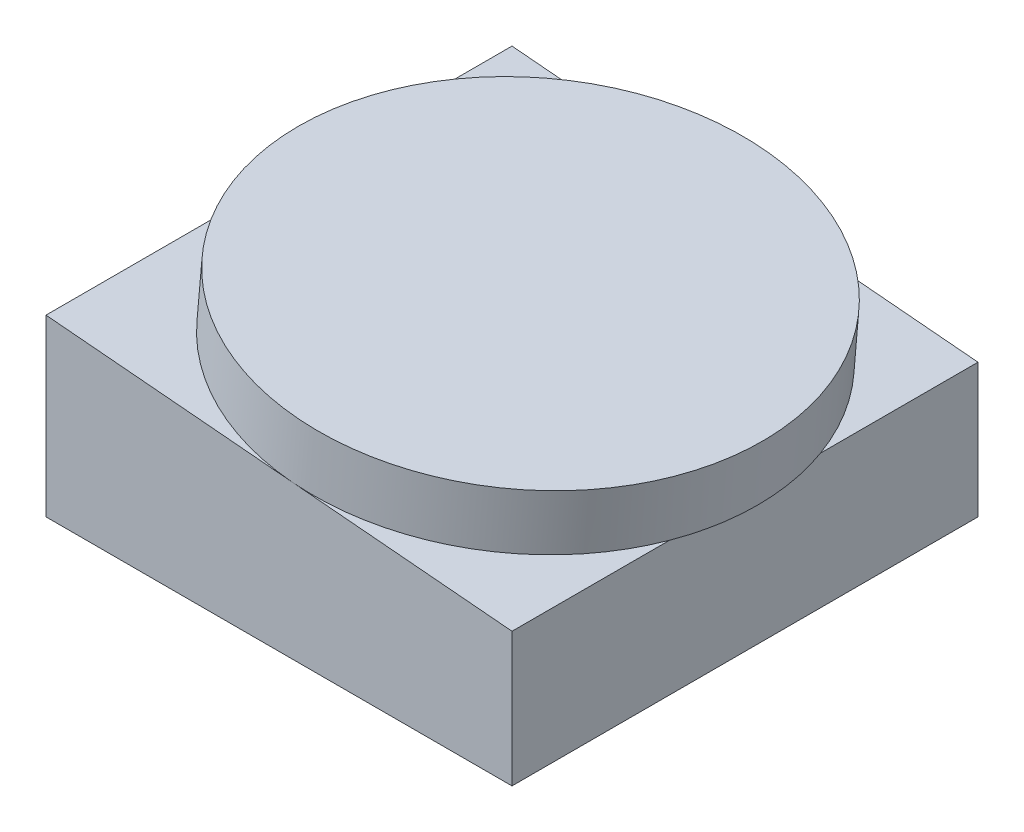
ISO-10303-21;
HEADER;
FILE_DESCRIPTION(('STEP AP214'),'2;1');
FILE_NAME('part.step','',(''),(''),'','','');
FILE_SCHEMA(('AUTOMOTIVE_DESIGN { 1 0 10303 214 1 1 1 1 }'));
ENDSEC;
DATA;
#1=APPLICATION_CONTEXT('core data for automotive mechanical design processes');
#2=APPLICATION_PROTOCOL_DEFINITION('international standard','automotive_design',2000,#1);
#3=PRODUCT_CONTEXT('',#1,'mechanical');
#4=PRODUCT('Part','Part','',(#3));
#5=PRODUCT_RELATED_PRODUCT_CATEGORY('part','',(#4));
#6=PRODUCT_DEFINITION_FORMATION('','',#4);
#7=PRODUCT_DEFINITION_CONTEXT('part definition',#1,'design');
#8=PRODUCT_DEFINITION('design','',#6,#7);
#9=PRODUCT_DEFINITION_SHAPE('','',#8);
#10=(LENGTH_UNIT() NAMED_UNIT(*) SI_UNIT(.MILLI.,.METRE.));
#11=(NAMED_UNIT(*) PLANE_ANGLE_UNIT() SI_UNIT($,.RADIAN.));
#12=(NAMED_UNIT(*) SI_UNIT($,.STERADIAN.) SOLID_ANGLE_UNIT());
#13=UNCERTAINTY_MEASURE_WITH_UNIT(LENGTH_MEASURE(1.E-05),#10,'distance_accuracy_value','');
#14=(GEOMETRIC_REPRESENTATION_CONTEXT(3) GLOBAL_UNCERTAINTY_ASSIGNED_CONTEXT((#13)) GLOBAL_UNIT_ASSIGNED_CONTEXT((#10,
#11,#12)) REPRESENTATION_CONTEXT('',''));
#15=CARTESIAN_POINT('',(0.,0.,0.));
#16=DIRECTION('',(0.,0.,1.));
#17=DIRECTION('',(1.,0.,0.));
#18=AXIS2_PLACEMENT_3D('',#15,#16,#17);
#19=CARTESIAN_POINT('',(1.15043886262406,13.1495763709223,0.));
#20=DIRECTION('',(-0.0871557427476583,-0.996194698091746,0.));
#21=DIRECTION('',(0.996194698091746,-0.0871557427476583,0.));
#22=AXIS2_PLACEMENT_3D('',#19,#20,#21);
#23=PLANE('',#22);
#24=CARTESIAN_POINT('',(1.15043886262406,13.1495763709223,0.));
#25=DIRECTION('',(0.0871557427476584,0.996194698091746,0.));
#26=DIRECTION('',(-0.996194698091746,0.0871557427476584,0.));
#27=AXIS2_PLACEMENT_3D('',#24,#25,#26);
#28=CIRCLE('',#27,20.);
#29=CARTESIAN_POINT('',(1.15043886262406,13.1495763709223,20.));
#30=VERTEX_POINT('',#29);
#31=CARTESIAN_POINT('',(20.,11.500453458963,6.47876828954221));
#32=VERTEX_POINT('',#31);
#33=EDGE_CURVE('E107',#30,#32,#28,.T.);
#34=ORIENTED_EDGE('',*,*,#33,.F.);
#35=DIRECTION('',(-0.996194698091746,0.0871557427476583,0.));
#36=VECTOR('',#35,1.);
#37=CARTESIAN_POINT('',(19.6961550602442,11.5270364466614,20.));
#38=LINE('',#37,#36);
#39=CARTESIAN_POINT('',(20.,11.500453458963,20.));
#40=VERTEX_POINT('',#39);
#41=EDGE_CURVE('E92',#40,#30,#38,.T.);
#42=ORIENTED_EDGE('',*,*,#41,.F.);
#43=DIRECTION('',(0.,0.,1.));
#44=VECTOR('',#43,1.);
#45=CARTESIAN_POINT('',(20.,11.500453458963,20.));
#46=LINE('',#45,#44);
#47=EDGE_CURVE('E61',#32,#40,#46,.T.);
#48=ORIENTED_EDGE('',*,*,#47,.F.);
#49=EDGE_LOOP('',(#34,#42,#48));
#50=FACE_BOUND('',#49,.T.);
#51=ADVANCED_FACE('F36',(#50),#23,.F.);
#52=CARTESIAN_POINT('',(20.,11.500453458963,-6.47876828954221));
#53=VERTEX_POINT('',#52);
#54=CARTESIAN_POINT('',(1.15043886262406,13.1495763709223,-20.));
#55=VERTEX_POINT('',#54);
#56=EDGE_CURVE('E11',#53,#55,#28,.T.);
#57=ORIENTED_EDGE('',*,*,#56,.F.);
#58=CARTESIAN_POINT('',(20.,11.500453458963,-20.));
#59=VERTEX_POINT('',#58);
#60=EDGE_CURVE('E105',#59,#53,#46,.T.);
#61=ORIENTED_EDGE('',*,*,#60,.F.);
#62=DIRECTION('',(0.996194698091746,-0.0871557427476583,0.));
#63=VECTOR('',#62,1.);
#64=CARTESIAN_POINT('',(19.6961550602442,11.5270364466614,-20.));
#65=LINE('',#64,#63);
#66=EDGE_CURVE('E117',#55,#59,#65,.T.);
#67=ORIENTED_EDGE('',*,*,#66,.F.);
#68=EDGE_LOOP('',(#57,#61,#67));
#69=FACE_BOUND('',#68,.T.);
#70=ADVANCED_FACE('F148',(#69),#23,.F.);
#71=CARTESIAN_POINT('',(-20.,15.,20.));
#72=DIRECTION('',(1.,0.,0.));
#73=DIRECTION('',(0.,0.,-1.));
#74=AXIS2_PLACEMENT_3D('',#71,#72,#73);
#75=PLANE('',#74);
#76=DIRECTION('',(0.,0.,1.));
#77=VECTOR('',#76,1.);
#78=CARTESIAN_POINT('',(-20.,0.,20.));
#79=LINE('',#78,#77);
#80=CARTESIAN_POINT('',(-20.,0.,-20.));
#81=VERTEX_POINT('',#80);
#82=CARTESIAN_POINT('',(-20.,0.,20.));
#83=VERTEX_POINT('',#82);
#84=EDGE_CURVE('E99',#81,#83,#79,.T.);
#85=ORIENTED_EDGE('',*,*,#84,.T.);
#86=DIRECTION('',(0.,-1.,0.));
#87=VECTOR('',#86,1.);
#88=CARTESIAN_POINT('',(-20.,15.,20.));
#89=LINE('',#88,#87);
#90=CARTESIAN_POINT('',(-20.,15.,20.));
#91=VERTEX_POINT('',#90);
#92=EDGE_CURVE('E40',#91,#83,#89,.T.);
#93=ORIENTED_EDGE('',*,*,#92,.F.);
#94=DIRECTION('',(0.,0.,1.));
#95=VECTOR('',#94,1.);
#96=CARTESIAN_POINT('',(-20.,15.,20.));
#97=LINE('',#96,#95);
#98=CARTESIAN_POINT('',(-20.,15.,-20.));
#99=VERTEX_POINT('',#98);
#100=EDGE_CURVE('E103',#99,#91,#97,.T.);
#101=ORIENTED_EDGE('',*,*,#100,.F.);
#102=DIRECTION('',(0.,-1.,0.));
#103=VECTOR('',#102,1.);
#104=CARTESIAN_POINT('',(-20.,15.,-20.));
#105=LINE('',#104,#103);
#106=EDGE_CURVE('E122',#99,#81,#105,.T.);
#107=ORIENTED_EDGE('',*,*,#106,.T.);
#108=EDGE_LOOP('',(#85,#93,#101,#107));
#109=FACE_BOUND('',#108,.T.);
#110=ADVANCED_FACE('F38',(#109),#75,.F.);
#111=CARTESIAN_POINT('',(20.,15.,20.));
#112=DIRECTION('',(0.,0.,-1.));
#113=DIRECTION('',(-1.,0.,0.));
#114=AXIS2_PLACEMENT_3D('',#111,#112,#113);
#115=PLANE('',#114);
#116=DIRECTION('',(0.,-1.,0.));
#117=VECTOR('',#116,1.);
#118=CARTESIAN_POINT('',(20.,15.,20.));
#119=LINE('',#118,#117);
#120=CARTESIAN_POINT('',(20.,0.,20.));
#121=VERTEX_POINT('',#120);
#122=EDGE_CURVE('E98',#40,#121,#119,.T.);
#123=ORIENTED_EDGE('',*,*,#122,.F.);
#124=ORIENTED_EDGE('',*,*,#41,.T.);
#125=EDGE_CURVE('E95',#30,#91,#38,.T.);
#126=ORIENTED_EDGE('',*,*,#125,.T.);
#127=ORIENTED_EDGE('',*,*,#92,.T.);
#128=DIRECTION('',(1.,0.,0.));
#129=VECTOR('',#128,1.);
#130=CARTESIAN_POINT('',(20.,0.,20.));
#131=LINE('',#130,#129);
#132=EDGE_CURVE('E126',#83,#121,#131,.T.);
#133=ORIENTED_EDGE('',*,*,#132,.T.);
#134=EDGE_LOOP('',(#123,#124,#126,#127,#133));
#135=FACE_BOUND('',#134,.T.);
#136=ADVANCED_FACE('F93',(#135),#115,.F.);
#137=CARTESIAN_POINT('',(20.,15.,20.));
#138=DIRECTION('',(-1.,0.,0.));
#139=DIRECTION('',(0.,0.,1.));
#140=AXIS2_PLACEMENT_3D('',#137,#138,#139);
#141=PLANE('',#140);
#142=DIRECTION('',(0.,-1.,0.));
#143=VECTOR('',#142,1.);
#144=CARTESIAN_POINT('',(20.,15.,-20.));
#145=LINE('',#144,#143);
#146=CARTESIAN_POINT('',(20.,0.,-20.));
#147=VERTEX_POINT('',#146);
#148=EDGE_CURVE('E134',#59,#147,#145,.T.);
#149=ORIENTED_EDGE('',*,*,#148,.F.);
#150=ORIENTED_EDGE('',*,*,#60,.T.);
#151=EDGE_CURVE('E119',#53,#32,#46,.T.);
#152=ORIENTED_EDGE('',*,*,#151,.T.);
#153=ORIENTED_EDGE('',*,*,#47,.T.);
#154=ORIENTED_EDGE('',*,*,#122,.T.);
#155=DIRECTION('',(0.,0.,-1.));
#156=VECTOR('',#155,1.);
#157=CARTESIAN_POINT('',(20.,0.,20.));
#158=LINE('',#157,#156);
#159=EDGE_CURVE('E128',#121,#147,#158,.T.);
#160=ORIENTED_EDGE('',*,*,#159,.T.);
#161=EDGE_LOOP('',(#149,#150,#152,#153,#154,#160));
#162=FACE_BOUND('',#161,.T.);
#163=ADVANCED_FACE('F137',(#162),#141,.F.);
#164=CARTESIAN_POINT('',(20.,15.,-20.));
#165=DIRECTION('',(0.,0.,1.));
#166=DIRECTION('',(1.,0.,0.));
#167=AXIS2_PLACEMENT_3D('',#164,#165,#166);
#168=PLANE('',#167);
#169=ORIENTED_EDGE('',*,*,#106,.F.);
#170=EDGE_CURVE('E114',#99,#55,#65,.T.);
#171=ORIENTED_EDGE('',*,*,#170,.T.);
#172=ORIENTED_EDGE('',*,*,#66,.T.);
#173=ORIENTED_EDGE('',*,*,#148,.T.);
#174=DIRECTION('',(-1.,0.,0.));
#175=VECTOR('',#174,1.);
#176=CARTESIAN_POINT('',(20.,0.,-20.));
#177=LINE('',#176,#175);
#178=EDGE_CURVE('E123',#147,#81,#177,.T.);
#179=ORIENTED_EDGE('',*,*,#178,.T.);
#180=EDGE_LOOP('',(#169,#171,#172,#173,#179));
#181=FACE_BOUND('',#180,.T.);
#182=ADVANCED_FACE('F145',(#181),#168,.F.);
#183=CARTESIAN_POINT('',(0.,0.,0.));
#184=DIRECTION('',(0.,1.,0.));
#185=DIRECTION('',(0.,0.,1.));
#186=AXIS2_PLACEMENT_3D('',#183,#184,#185);
#187=PLANE('',#186);
#188=ORIENTED_EDGE('',*,*,#84,.F.);
#189=ORIENTED_EDGE('',*,*,#178,.F.);
#190=ORIENTED_EDGE('',*,*,#159,.F.);
#191=ORIENTED_EDGE('',*,*,#132,.F.);
#192=EDGE_LOOP('',(#188,#189,#190,#191));
#193=FACE_BOUND('',#192,.T.);
#194=ADVANCED_FACE('F142',(#193),#187,.F.);
#195=EDGE_CURVE('E45',#55,#30,#28,.T.);
#196=ORIENTED_EDGE('',*,*,#195,.F.);
#197=ORIENTED_EDGE('',*,*,#170,.F.);
#198=ORIENTED_EDGE('',*,*,#100,.T.);
#199=ORIENTED_EDGE('',*,*,#125,.F.);
#200=EDGE_LOOP('',(#196,#197,#198,#199));
#201=FACE_BOUND('',#200,.T.);
#202=ADVANCED_FACE('F101',(#201),#23,.F.);
#203=CARTESIAN_POINT('',(1.58621757636235,18.130549861381,0.));
#204=DIRECTION('',(-0.0871557427476583,-0.996194698091746,0.));
#205=DIRECTION('',(0.996194698091746,-0.0871557427476583,0.));
#206=AXIS2_PLACEMENT_3D('',#203,#204,#205);
#207=CYLINDRICAL_SURFACE('',#206,20.);
#208=CARTESIAN_POINT('',(1.58621757636235,18.130549861381,0.));
#209=DIRECTION('',(0.0871557427476584,0.996194698091746,0.));
#210=DIRECTION('',(-0.996194698091746,0.0871557427476584,0.));
#211=AXIS2_PLACEMENT_3D('',#208,#209,#210);
#212=CIRCLE('',#211,20.);
#213=CARTESIAN_POINT('',(-18.3376763854726,19.8736647163342,0.));
#214=VERTEX_POINT('',#213);
#215=EDGE_CURVE('E110',#214,#214,#212,.T.);
#216=ORIENTED_EDGE('',*,*,#215,.F.);
#217=EDGE_LOOP('',(#216));
#218=FACE_BOUND('',#217,.T.);
#219=ORIENTED_EDGE('',*,*,#33,.T.);
#220=EDGE_CURVE('E47',#32,#53,#28,.T.);
#221=ORIENTED_EDGE('',*,*,#220,.T.);
#222=ORIENTED_EDGE('',*,*,#56,.T.);
#223=ORIENTED_EDGE('',*,*,#195,.T.);
#224=EDGE_LOOP('',(#219,#221,#222,#223));
#225=FACE_BOUND('',#224,.T.);
#226=ADVANCED_FACE('F111',(#218,#225),#207,.T.);
#227=CARTESIAN_POINT('',(1.58621757636235,18.130549861381,0.));
#228=DIRECTION('',(0.0871557427476584,0.996194698091746,0.));
#229=DIRECTION('',(-0.996194698091746,0.0871557427476584,0.));
#230=AXIS2_PLACEMENT_3D('',#227,#228,#229);
#231=PLANE('',#230);
#232=ORIENTED_EDGE('',*,*,#215,.T.);
#233=EDGE_LOOP('',(#232));
#234=FACE_BOUND('',#233,.T.);
#235=ADVANCED_FACE('F165',(#234),#231,.T.);
#236=CARTESIAN_POINT('',(1.15043886262406,13.1495763709223,0.));
#237=DIRECTION('',(0.0871557427476584,0.996194698091746,0.));
#238=DIRECTION('',(-0.996194698091746,0.0871557427476584,0.));
#239=AXIS2_PLACEMENT_3D('',#236,#237,#238);
#240=PLANE('',#239);
#241=ORIENTED_EDGE('',*,*,#151,.F.);
#242=ORIENTED_EDGE('',*,*,#220,.F.);
#243=EDGE_LOOP('',(#241,#242));
#244=FACE_BOUND('',#243,.T.);
#245=ADVANCED_FACE('F203',(#244),#240,.F.);
#246=CLOSED_SHELL('',(#51,#70,#110,#136,#163,#182,#194,#202,#226,#235,#245));
#247=MANIFOLD_SOLID_BREP('B2',#246);
#248=ADVANCED_BREP_SHAPE_REPRESENTATION('',(#18,#247),#14);
#249=SHAPE_DEFINITION_REPRESENTATION(#9,#248);
ENDSEC;
END-ISO-10303-21;
